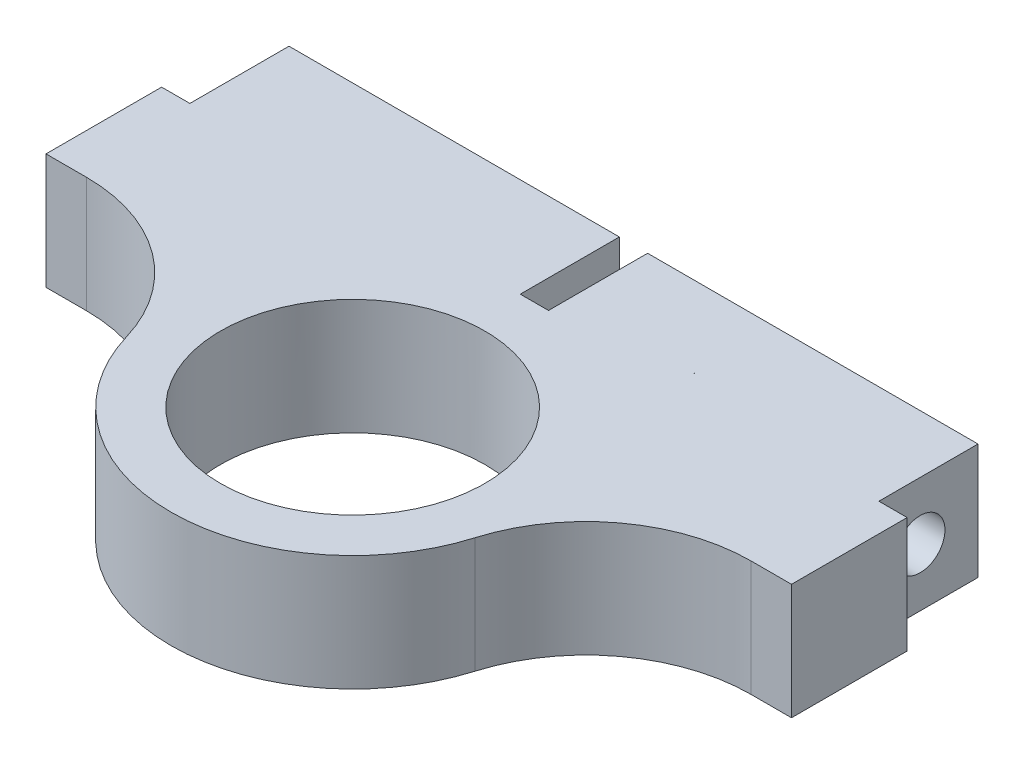
ISO-10303-21;
HEADER;
FILE_DESCRIPTION(('STEP AP214'),'2;1');
FILE_NAME('part.step','',(''),(''),'','','');
FILE_SCHEMA(('AUTOMOTIVE_DESIGN { 1 0 10303 214 1 1 1 1 }'));
ENDSEC;
DATA;
#1=APPLICATION_CONTEXT('core data for automotive mechanical design processes');
#2=APPLICATION_PROTOCOL_DEFINITION('international standard','automotive_design',2000,#1);
#3=PRODUCT_CONTEXT('',#1,'mechanical');
#4=PRODUCT('Part','Part','',(#3));
#5=PRODUCT_RELATED_PRODUCT_CATEGORY('part','',(#4));
#6=PRODUCT_DEFINITION_FORMATION('','',#4);
#7=PRODUCT_DEFINITION_CONTEXT('part definition',#1,'design');
#8=PRODUCT_DEFINITION('design','',#6,#7);
#9=PRODUCT_DEFINITION_SHAPE('','',#8);
#10=(LENGTH_UNIT() NAMED_UNIT(*) SI_UNIT(.MILLI.,.METRE.));
#11=(NAMED_UNIT(*) PLANE_ANGLE_UNIT() SI_UNIT($,.RADIAN.));
#12=(NAMED_UNIT(*) SI_UNIT($,.STERADIAN.) SOLID_ANGLE_UNIT());
#13=UNCERTAINTY_MEASURE_WITH_UNIT(LENGTH_MEASURE(1.E-05),#10,'distance_accuracy_value','');
#14=(GEOMETRIC_REPRESENTATION_CONTEXT(3) GLOBAL_UNCERTAINTY_ASSIGNED_CONTEXT((#13)) GLOBAL_UNIT_ASSIGNED_CONTEXT((#10,
#11,#12)) REPRESENTATION_CONTEXT('',''));
#15=CARTESIAN_POINT('',(0.,0.,0.));
#16=DIRECTION('',(0.,0.,1.));
#17=DIRECTION('',(1.,0.,0.));
#18=AXIS2_PLACEMENT_3D('',#15,#16,#17);
#19=CARTESIAN_POINT('',(23.42,0.,0.));
#20=DIRECTION('',(-1.,0.,0.));
#21=DIRECTION('',(0.,0.,1.));
#22=AXIS2_PLACEMENT_3D('',#19,#20,#21);
#23=PLANE('',#22);
#24=CARTESIAN_POINT('',(23.42,3.5,-5.5));
#25=DIRECTION('',(-1.,0.,0.));
#26=DIRECTION('',(0.,0.,1.));
#27=AXIS2_PLACEMENT_3D('',#24,#25,#26);
#28=CIRCLE('',#27,1.5);
#29=CARTESIAN_POINT('',(23.42,3.5,-4.));
#30=VERTEX_POINT('',#29);
#31=EDGE_CURVE('E200',#30,#30,#28,.T.);
#32=ORIENTED_EDGE('',*,*,#31,.F.);
#33=EDGE_LOOP('',(#32));
#34=FACE_BOUND('',#33,.T.);
#35=DIRECTION('',(0.,1.,0.));
#36=VECTOR('',#35,1.);
#37=CARTESIAN_POINT('',(23.42,-14.,-9.));
#38=LINE('',#37,#36);
#39=CARTESIAN_POINT('',(23.42,0.,-9.));
#40=VERTEX_POINT('',#39);
#41=CARTESIAN_POINT('',(23.42,7.,-9.));
#42=VERTEX_POINT('',#41);
#43=EDGE_CURVE('E218',#40,#42,#38,.T.);
#44=ORIENTED_EDGE('',*,*,#43,.F.);
#45=DIRECTION('',(0.,0.,-1.));
#46=VECTOR('',#45,1.);
#47=CARTESIAN_POINT('',(23.42,0.,-3.));
#48=LINE('',#47,#46);
#49=CARTESIAN_POINT('',(23.42,0.,-3.));
#50=VERTEX_POINT('',#49);
#51=EDGE_CURVE('E333',#50,#40,#48,.T.);
#52=ORIENTED_EDGE('',*,*,#51,.F.);
#53=DIRECTION('',(0.,1.,0.));
#54=VECTOR('',#53,1.);
#55=CARTESIAN_POINT('',(23.42,-14.,-3.));
#56=LINE('',#55,#54);
#57=CARTESIAN_POINT('',(23.42,7.,-3.));
#58=VERTEX_POINT('',#57);
#59=EDGE_CURVE('E219',#50,#58,#56,.T.);
#60=ORIENTED_EDGE('',*,*,#59,.T.);
#61=DIRECTION('',(0.,0.,1.));
#62=VECTOR('',#61,1.);
#63=CARTESIAN_POINT('',(23.42,7.,-12.));
#64=LINE('',#63,#62);
#65=EDGE_CURVE('E254',#42,#58,#64,.T.);
#66=ORIENTED_EDGE('',*,*,#65,.F.);
#67=EDGE_LOOP('',(#44,#52,#60,#66));
#68=FACE_BOUND('',#67,.T.);
#69=ADVANCED_FACE('F42',(#34,#68),#23,.T.);
#70=CARTESIAN_POINT('',(21.71,0.,0.));
#71=DIRECTION('',(1.,0.,0.));
#72=DIRECTION('',(0.,0.,-1.));
#73=AXIS2_PLACEMENT_3D('',#70,#71,#72);
#74=PLANE('',#73);
#75=CARTESIAN_POINT('',(21.71,3.5,-5.5));
#76=DIRECTION('',(1.,0.,0.));
#77=DIRECTION('',(0.,0.,-1.));
#78=AXIS2_PLACEMENT_3D('',#75,#76,#77);
#79=CIRCLE('',#78,1.5);
#80=CARTESIAN_POINT('',(21.71,3.5,-7.));
#81=VERTEX_POINT('',#80);
#82=EDGE_CURVE('E196',#81,#81,#79,.T.);
#83=ORIENTED_EDGE('',*,*,#82,.F.);
#84=EDGE_LOOP('',(#83));
#85=FACE_BOUND('',#84,.T.);
#86=DIRECTION('',(0.,1.,0.));
#87=VECTOR('',#86,1.);
#88=CARTESIAN_POINT('',(21.71,-14.,-3.));
#89=LINE('',#88,#87);
#90=CARTESIAN_POINT('',(21.71,0.,-3.));
#91=VERTEX_POINT('',#90);
#92=CARTESIAN_POINT('',(21.71,7.,-3.));
#93=VERTEX_POINT('',#92);
#94=EDGE_CURVE('E228',#91,#93,#89,.T.);
#95=ORIENTED_EDGE('',*,*,#94,.F.);
#96=DIRECTION('',(0.,0.,1.));
#97=VECTOR('',#96,1.);
#98=CARTESIAN_POINT('',(21.71,0.,-9.));
#99=LINE('',#98,#97);
#100=CARTESIAN_POINT('',(21.71,0.,-9.));
#101=VERTEX_POINT('',#100);
#102=EDGE_CURVE('E327',#101,#91,#99,.T.);
#103=ORIENTED_EDGE('',*,*,#102,.F.);
#104=DIRECTION('',(0.,1.,0.));
#105=VECTOR('',#104,1.);
#106=CARTESIAN_POINT('',(21.71,-14.,-9.));
#107=LINE('',#106,#105);
#108=CARTESIAN_POINT('',(21.71,7.,-9.));
#109=VERTEX_POINT('',#108);
#110=EDGE_CURVE('E209',#101,#109,#107,.T.);
#111=ORIENTED_EDGE('',*,*,#110,.T.);
#112=DIRECTION('',(0.,0.,-1.));
#113=VECTOR('',#112,1.);
#114=CARTESIAN_POINT('',(21.71,7.,-6.));
#115=LINE('',#114,#113);
#116=EDGE_CURVE('E258',#93,#109,#115,.T.);
#117=ORIENTED_EDGE('',*,*,#116,.F.);
#118=EDGE_LOOP('',(#95,#103,#111,#117));
#119=FACE_BOUND('',#118,.T.);
#120=ADVANCED_FACE('F373',(#85,#119),#74,.T.);
#121=CARTESIAN_POINT('',(1.71,0.,0.));
#122=DIRECTION('',(-1.,0.,0.));
#123=DIRECTION('',(0.,0.,1.));
#124=AXIS2_PLACEMENT_3D('',#121,#122,#123);
#125=PLANE('',#124);
#126=CARTESIAN_POINT('',(1.71,3.5,-5.5));
#127=DIRECTION('',(-1.,0.,0.));
#128=DIRECTION('',(0.,0.,1.));
#129=AXIS2_PLACEMENT_3D('',#126,#127,#128);
#130=CIRCLE('',#129,1.5);
#131=CARTESIAN_POINT('',(1.71,3.5,-4.));
#132=VERTEX_POINT('',#131);
#133=EDGE_CURVE('E183',#132,#132,#130,.T.);
#134=ORIENTED_EDGE('',*,*,#133,.F.);
#135=EDGE_LOOP('',(#134));
#136=FACE_BOUND('',#135,.T.);
#137=DIRECTION('',(0.,1.,0.));
#138=VECTOR('',#137,1.);
#139=CARTESIAN_POINT('',(1.71,0.,-9.));
#140=LINE('',#139,#138);
#141=CARTESIAN_POINT('',(1.71,0.,-9.));
#142=VERTEX_POINT('',#141);
#143=CARTESIAN_POINT('',(1.71,7.,-9.));
#144=VERTEX_POINT('',#143);
#145=EDGE_CURVE('E277',#142,#144,#140,.T.);
#146=ORIENTED_EDGE('',*,*,#145,.F.);
#147=DIRECTION('',(0.,0.,-1.));
#148=VECTOR('',#147,1.);
#149=CARTESIAN_POINT('',(1.71,0.,-3.));
#150=LINE('',#149,#148);
#151=CARTESIAN_POINT('',(1.71,0.,-3.));
#152=VERTEX_POINT('',#151);
#153=EDGE_CURVE('E321',#152,#142,#150,.T.);
#154=ORIENTED_EDGE('',*,*,#153,.F.);
#155=DIRECTION('',(0.,1.,0.));
#156=VECTOR('',#155,1.);
#157=CARTESIAN_POINT('',(1.71,-14.,-3.));
#158=LINE('',#157,#156);
#159=CARTESIAN_POINT('',(1.71,7.,-3.));
#160=VERTEX_POINT('',#159);
#161=EDGE_CURVE('E245',#152,#160,#158,.T.);
#162=ORIENTED_EDGE('',*,*,#161,.T.);
#163=DIRECTION('',(0.,0.,1.));
#164=VECTOR('',#163,1.);
#165=CARTESIAN_POINT('',(1.71,7.,-12.));
#166=LINE('',#165,#164);
#167=EDGE_CURVE('E262',#144,#160,#166,.T.);
#168=ORIENTED_EDGE('',*,*,#167,.F.);
#169=EDGE_LOOP('',(#146,#154,#162,#168));
#170=FACE_BOUND('',#169,.T.);
#171=ADVANCED_FACE('F361',(#136,#170),#125,.T.);
#172=CARTESIAN_POINT('',(0.,10.,0.));
#173=DIRECTION('',(-1.,0.,0.));
#174=DIRECTION('',(0.,0.,1.));
#175=AXIS2_PLACEMENT_3D('',#172,#173,#174);
#176=PLANE('',#175);
#177=DIRECTION('',(0.,1.,0.));
#178=VECTOR('',#177,1.);
#179=CARTESIAN_POINT('',(0.,10.,-3.));
#180=LINE('',#179,#178);
#181=CARTESIAN_POINT('',(0.,0.,-3.));
#182=VERTEX_POINT('',#181);
#183=CARTESIAN_POINT('',(0.,7.,-3.));
#184=VERTEX_POINT('',#183);
#185=EDGE_CURVE('E274',#182,#184,#180,.T.);
#186=ORIENTED_EDGE('',*,*,#185,.F.);
#187=DIRECTION('',(0.,0.,-1.));
#188=VECTOR('',#187,1.);
#189=CARTESIAN_POINT('',(0.,0.,3.99999999999998));
#190=LINE('',#189,#188);
#191=CARTESIAN_POINT('',(0.,0.,3.99999999999998));
#192=VERTEX_POINT('',#191);
#193=EDGE_CURVE('E315',#192,#182,#190,.T.);
#194=ORIENTED_EDGE('',*,*,#193,.F.);
#195=DIRECTION('',(0.,-1.,0.));
#196=VECTOR('',#195,1.);
#197=CARTESIAN_POINT('',(0.,7.,3.99999999999998));
#198=LINE('',#197,#196);
#199=CARTESIAN_POINT('',(0.,7.,3.99999999999998));
#200=VERTEX_POINT('',#199);
#201=EDGE_CURVE('E184',#200,#192,#198,.T.);
#202=ORIENTED_EDGE('',*,*,#201,.F.);
#203=DIRECTION('',(0.,0.,1.));
#204=VECTOR('',#203,1.);
#205=CARTESIAN_POINT('',(0.,7.,-6.));
#206=LINE('',#205,#204);
#207=EDGE_CURVE('E266',#184,#200,#206,.T.);
#208=ORIENTED_EDGE('',*,*,#207,.F.);
#209=EDGE_LOOP('',(#186,#194,#202,#208));
#210=FACE_BOUND('',#209,.T.);
#211=ADVANCED_FACE('F352',(#210),#176,.T.);
#212=CARTESIAN_POINT('',(22.565,10.,8.));
#213=DIRECTION('',(0.,-1.,0.));
#214=DIRECTION('',(0.,0.,-1.));
#215=AXIS2_PLACEMENT_3D('',#212,#213,#214);
#216=CYLINDRICAL_SURFACE('',#215,11.);
#217=CARTESIAN_POINT('',(22.565,0.,8.));
#218=DIRECTION('',(0.,-1.,0.));
#219=DIRECTION('',(0.,0.,-1.));
#220=AXIS2_PLACEMENT_3D('',#217,#218,#219);
#221=CIRCLE('',#220,11.);
#222=CARTESIAN_POINT('',(33.106463322499,0.,11.1428571428571));
#223=VERTEX_POINT('',#222);
#224=CARTESIAN_POINT('',(12.023536677501,0.,11.1428571428571));
#225=VERTEX_POINT('',#224);
#226=EDGE_CURVE('E59',#223,#225,#221,.T.);
#227=ORIENTED_EDGE('',*,*,#226,.F.);
#228=DIRECTION('',(0.,-1.,0.));
#229=VECTOR('',#228,1.);
#230=CARTESIAN_POINT('',(33.106463322499,10.,11.1428571428571));
#231=LINE('',#230,#229);
#232=CARTESIAN_POINT('',(33.106463322499,7.,11.1428571428571));
#233=VERTEX_POINT('',#232);
#234=EDGE_CURVE('E287',#223,#233,#231,.F.);
#235=ORIENTED_EDGE('',*,*,#234,.T.);
#236=CARTESIAN_POINT('',(22.565,7.,8.));
#237=DIRECTION('',(0.,1.,0.));
#238=DIRECTION('',(0.,0.,1.));
#239=AXIS2_PLACEMENT_3D('',#236,#237,#238);
#240=CIRCLE('',#239,11.);
#241=CARTESIAN_POINT('',(12.023536677501,7.,11.1428571428571));
#242=VERTEX_POINT('',#241);
#243=EDGE_CURVE('E270',#242,#233,#240,.T.);
#244=ORIENTED_EDGE('',*,*,#243,.F.);
#245=DIRECTION('',(0.,-1.,0.));
#246=VECTOR('',#245,1.);
#247=CARTESIAN_POINT('',(12.023536677501,10.,11.1428571428571));
#248=LINE('',#247,#246);
#249=EDGE_CURVE('E280',#242,#225,#248,.T.);
#250=ORIENTED_EDGE('',*,*,#249,.T.);
#251=EDGE_LOOP('',(#227,#235,#244,#250));
#252=FACE_BOUND('',#251,.T.);
#253=ADVANCED_FACE('F419',(#252),#216,.T.);
#254=CARTESIAN_POINT('',(45.13,10.,0.));
#255=DIRECTION('',(1.,0.,0.));
#256=DIRECTION('',(0.,0.,-1.));
#257=AXIS2_PLACEMENT_3D('',#254,#255,#256);
#258=PLANE('',#257);
#259=DIRECTION('',(0.,1.,0.));
#260=VECTOR('',#259,1.);
#261=CARTESIAN_POINT('',(45.13,-6.5,3.99999999999998));
#262=LINE('',#261,#260);
#263=CARTESIAN_POINT('',(45.13,0.,3.99999999999998));
#264=VERTEX_POINT('',#263);
#265=CARTESIAN_POINT('',(45.13,7.,3.99999999999998));
#266=VERTEX_POINT('',#265);
#267=EDGE_CURVE('E171',#264,#266,#262,.T.);
#268=ORIENTED_EDGE('',*,*,#267,.F.);
#269=DIRECTION('',(0.,0.,1.));
#270=VECTOR('',#269,1.);
#271=CARTESIAN_POINT('',(45.13,0.,-3.));
#272=LINE('',#271,#270);
#273=CARTESIAN_POINT('',(45.13,0.,-3.));
#274=VERTEX_POINT('',#273);
#275=EDGE_CURVE('E155',#274,#264,#272,.T.);
#276=ORIENTED_EDGE('',*,*,#275,.F.);
#277=DIRECTION('',(0.,1.,0.));
#278=VECTOR('',#277,1.);
#279=CARTESIAN_POINT('',(45.13,-14.,-3.));
#280=LINE('',#279,#278);
#281=CARTESIAN_POINT('',(45.13,7.,-3.));
#282=VERTEX_POINT('',#281);
#283=EDGE_CURVE('E229',#274,#282,#280,.T.);
#284=ORIENTED_EDGE('',*,*,#283,.T.);
#285=DIRECTION('',(0.,0.,-1.));
#286=VECTOR('',#285,1.);
#287=CARTESIAN_POINT('',(45.13,7.,0.));
#288=LINE('',#287,#286);
#289=EDGE_CURVE('E180',#266,#282,#288,.T.);
#290=ORIENTED_EDGE('',*,*,#289,.F.);
#291=EDGE_LOOP('',(#268,#276,#284,#290));
#292=FACE_BOUND('',#291,.T.);
#293=ADVANCED_FACE('F178',(#292),#258,.T.);
#294=CARTESIAN_POINT('',(43.42,0.,0.));
#295=DIRECTION('',(1.,0.,0.));
#296=DIRECTION('',(0.,0.,-1.));
#297=AXIS2_PLACEMENT_3D('',#294,#295,#296);
#298=PLANE('',#297);
#299=CARTESIAN_POINT('',(43.42,3.5,-5.5));
#300=DIRECTION('',(1.,0.,0.));
#301=DIRECTION('',(0.,0.,-1.));
#302=AXIS2_PLACEMENT_3D('',#299,#300,#301);
#303=CIRCLE('',#302,1.5);
#304=CARTESIAN_POINT('',(43.42,3.5,-7.));
#305=VERTEX_POINT('',#304);
#306=EDGE_CURVE('E189',#305,#305,#303,.T.);
#307=ORIENTED_EDGE('',*,*,#306,.F.);
#308=EDGE_LOOP('',(#307));
#309=FACE_BOUND('',#308,.T.);
#310=DIRECTION('',(0.,1.,0.));
#311=VECTOR('',#310,1.);
#312=CARTESIAN_POINT('',(43.42,-14.,-3.));
#313=LINE('',#312,#311);
#314=CARTESIAN_POINT('',(43.42,0.,-3.));
#315=VERTEX_POINT('',#314);
#316=CARTESIAN_POINT('',(43.42,7.,-3.));
#317=VERTEX_POINT('',#316);
#318=EDGE_CURVE('E237',#315,#317,#313,.T.);
#319=ORIENTED_EDGE('',*,*,#318,.F.);
#320=DIRECTION('',(0.,0.,1.));
#321=VECTOR('',#320,1.);
#322=CARTESIAN_POINT('',(43.42,0.,-9.));
#323=LINE('',#322,#321);
#324=CARTESIAN_POINT('',(43.42,0.,-9.));
#325=VERTEX_POINT('',#324);
#326=EDGE_CURVE('E339',#325,#315,#323,.T.);
#327=ORIENTED_EDGE('',*,*,#326,.F.);
#328=DIRECTION('',(0.,1.,0.));
#329=VECTOR('',#328,1.);
#330=CARTESIAN_POINT('',(43.42,-14.,-9.));
#331=LINE('',#330,#329);
#332=CARTESIAN_POINT('',(43.42,7.,-9.));
#333=VERTEX_POINT('',#332);
#334=EDGE_CURVE('E210',#325,#333,#331,.T.);
#335=ORIENTED_EDGE('',*,*,#334,.T.);
#336=DIRECTION('',(0.,0.,-1.));
#337=VECTOR('',#336,1.);
#338=CARTESIAN_POINT('',(43.42,7.,-6.));
#339=LINE('',#338,#337);
#340=EDGE_CURVE('E250',#317,#333,#339,.T.);
#341=ORIENTED_EDGE('',*,*,#340,.F.);
#342=EDGE_LOOP('',(#319,#327,#335,#341));
#343=FACE_BOUND('',#342,.T.);
#344=ADVANCED_FACE('F390',(#309,#343),#298,.T.);
#345=CARTESIAN_POINT('',(0.,-14.,-9.));
#346=DIRECTION('',(0.,0.,1.));
#347=DIRECTION('',(1.,0.,0.));
#348=AXIS2_PLACEMENT_3D('',#345,#346,#347);
#349=PLANE('',#348);
#350=DIRECTION('',(1.,0.,0.));
#351=VECTOR('',#350,1.);
#352=CARTESIAN_POINT('',(23.42,0.,-9.));
#353=LINE('',#352,#351);
#354=EDGE_CURVE('E336',#40,#325,#353,.T.);
#355=ORIENTED_EDGE('',*,*,#354,.F.);
#356=ORIENTED_EDGE('',*,*,#43,.T.);
#357=DIRECTION('',(1.,0.,0.));
#358=VECTOR('',#357,1.);
#359=CARTESIAN_POINT('',(0.,7.,-9.));
#360=LINE('',#359,#358);
#361=EDGE_CURVE('E214',#42,#333,#360,.T.);
#362=ORIENTED_EDGE('',*,*,#361,.T.);
#363=ORIENTED_EDGE('',*,*,#334,.F.);
#364=EDGE_LOOP('',(#355,#356,#362,#363));
#365=FACE_BOUND('',#364,.T.);
#366=ADVANCED_FACE('F384',(#365),#349,.F.);
#367=CARTESIAN_POINT('',(0.,-14.,-3.));
#368=DIRECTION('',(0.,0.,1.));
#369=DIRECTION('',(1.,0.,0.));
#370=AXIS2_PLACEMENT_3D('',#367,#368,#369);
#371=PLANE('',#370);
#372=DIRECTION('',(1.,0.,0.));
#373=VECTOR('',#372,1.);
#374=CARTESIAN_POINT('',(43.42,0.,-3.));
#375=LINE('',#374,#373);
#376=EDGE_CURVE('E161',#315,#274,#375,.T.);
#377=ORIENTED_EDGE('',*,*,#376,.F.);
#378=ORIENTED_EDGE('',*,*,#318,.T.);
#379=DIRECTION('',(1.,0.,0.));
#380=VECTOR('',#379,1.);
#381=CARTESIAN_POINT('',(0.,7.,-3.));
#382=LINE('',#381,#380);
#383=EDGE_CURVE('E204',#317,#282,#382,.T.);
#384=ORIENTED_EDGE('',*,*,#383,.T.);
#385=ORIENTED_EDGE('',*,*,#283,.F.);
#386=EDGE_LOOP('',(#377,#378,#384,#385));
#387=FACE_BOUND('',#386,.T.);
#388=ADVANCED_FACE('F393',(#387),#371,.F.);
#389=CARTESIAN_POINT('',(0.,-14.,-3.));
#390=DIRECTION('',(0.,0.,1.));
#391=DIRECTION('',(1.,0.,0.));
#392=AXIS2_PLACEMENT_3D('',#389,#390,#391);
#393=PLANE('',#392);
#394=DIRECTION('',(1.,0.,0.));
#395=VECTOR('',#394,1.);
#396=CARTESIAN_POINT('',(0.,0.,-3.));
#397=LINE('',#396,#395);
#398=EDGE_CURVE('E318',#182,#152,#397,.T.);
#399=ORIENTED_EDGE('',*,*,#398,.F.);
#400=ORIENTED_EDGE('',*,*,#185,.T.);
#401=DIRECTION('',(1.,0.,0.));
#402=VECTOR('',#401,1.);
#403=CARTESIAN_POINT('',(0.,7.,-3.));
#404=LINE('',#403,#402);
#405=EDGE_CURVE('E213',#184,#160,#404,.T.);
#406=ORIENTED_EDGE('',*,*,#405,.T.);
#407=ORIENTED_EDGE('',*,*,#161,.F.);
#408=EDGE_LOOP('',(#399,#400,#406,#407));
#409=FACE_BOUND('',#408,.T.);
#410=ADVANCED_FACE('F357',(#409),#393,.F.);
#411=CARTESIAN_POINT('',(0.,-14.,-9.));
#412=DIRECTION('',(0.,0.,1.));
#413=DIRECTION('',(1.,0.,0.));
#414=AXIS2_PLACEMENT_3D('',#411,#412,#413);
#415=PLANE('',#414);
#416=DIRECTION('',(1.,0.,0.));
#417=VECTOR('',#416,1.);
#418=CARTESIAN_POINT('',(1.71,0.,-9.));
#419=LINE('',#418,#417);
#420=EDGE_CURVE('E324',#142,#101,#419,.T.);
#421=ORIENTED_EDGE('',*,*,#420,.F.);
#422=ORIENTED_EDGE('',*,*,#145,.T.);
#423=DIRECTION('',(1.,0.,0.));
#424=VECTOR('',#423,1.);
#425=CARTESIAN_POINT('',(0.,7.,-9.));
#426=LINE('',#425,#424);
#427=EDGE_CURVE('E205',#144,#109,#426,.T.);
#428=ORIENTED_EDGE('',*,*,#427,.T.);
#429=ORIENTED_EDGE('',*,*,#110,.F.);
#430=EDGE_LOOP('',(#421,#422,#428,#429));
#431=FACE_BOUND('',#430,.T.);
#432=ADVANCED_FACE('F368',(#431),#415,.F.);
#433=CARTESIAN_POINT('',(0.,-14.,-3.));
#434=DIRECTION('',(0.,0.,1.));
#435=DIRECTION('',(1.,0.,0.));
#436=AXIS2_PLACEMENT_3D('',#433,#434,#435);
#437=PLANE('',#436);
#438=DIRECTION('',(1.,0.,0.));
#439=VECTOR('',#438,1.);
#440=CARTESIAN_POINT('',(21.71,0.,-3.));
#441=LINE('',#440,#439);
#442=EDGE_CURVE('E330',#91,#50,#441,.T.);
#443=ORIENTED_EDGE('',*,*,#442,.F.);
#444=ORIENTED_EDGE('',*,*,#94,.T.);
#445=DIRECTION('',(1.,0.,0.));
#446=VECTOR('',#445,1.);
#447=CARTESIAN_POINT('',(0.,7.,-3.));
#448=LINE('',#447,#446);
#449=EDGE_CURVE('E224',#93,#58,#448,.T.);
#450=ORIENTED_EDGE('',*,*,#449,.T.);
#451=ORIENTED_EDGE('',*,*,#59,.F.);
#452=EDGE_LOOP('',(#443,#444,#450,#451));
#453=FACE_BOUND('',#452,.T.);
#454=ADVANCED_FACE('F375',(#453),#437,.F.);
#455=CARTESIAN_POINT('',(0.,0.,3.99999999999998));
#456=DIRECTION('',(0.,0.,1.));
#457=DIRECTION('',(1.,0.,0.));
#458=AXIS2_PLACEMENT_3D('',#455,#456,#457);
#459=PLANE('',#458);
#460=DIRECTION('',(0.,-1.,0.));
#461=VECTOR('',#460,1.);
#462=CARTESIAN_POINT('',(42.6896117974981,0.,3.99999999999998));
#463=LINE('',#462,#461);
#464=CARTESIAN_POINT('',(42.6896117974981,7.,3.99999999999998));
#465=VERTEX_POINT('',#464);
#466=CARTESIAN_POINT('',(42.6896117974981,0.,3.99999999999998));
#467=VERTEX_POINT('',#466);
#468=EDGE_CURVE('E174',#465,#467,#463,.T.);
#469=ORIENTED_EDGE('',*,*,#468,.T.);
#470=DIRECTION('',(-1.,0.,0.));
#471=VECTOR('',#470,1.);
#472=CARTESIAN_POINT('',(45.13,0.,3.99999999999998));
#473=LINE('',#472,#471);
#474=EDGE_CURVE('E158',#264,#467,#473,.T.);
#475=ORIENTED_EDGE('',*,*,#474,.F.);
#476=ORIENTED_EDGE('',*,*,#267,.T.);
#477=DIRECTION('',(-1.,0.,0.));
#478=VECTOR('',#477,1.);
#479=CARTESIAN_POINT('',(45.13,7.,3.99999999999998));
#480=LINE('',#479,#478);
#481=EDGE_CURVE('E192',#266,#465,#480,.T.);
#482=ORIENTED_EDGE('',*,*,#481,.T.);
#483=EDGE_LOOP('',(#469,#475,#476,#482));
#484=FACE_BOUND('',#483,.T.);
#485=ADVANCED_FACE('F169',(#484),#459,.T.);
#486=ORIENTED_EDGE('',*,*,#201,.T.);
#487=DIRECTION('',(-1.,0.,0.));
#488=VECTOR('',#487,1.);
#489=CARTESIAN_POINT('',(2.4403882025019,0.,3.99999999999998));
#490=LINE('',#489,#488);
#491=CARTESIAN_POINT('',(2.4403882025019,0.,3.99999999999998));
#492=VERTEX_POINT('',#491);
#493=EDGE_CURVE('E312',#492,#192,#490,.T.);
#494=ORIENTED_EDGE('',*,*,#493,.F.);
#495=DIRECTION('',(0.,-1.,0.));
#496=VECTOR('',#495,1.);
#497=CARTESIAN_POINT('',(2.4403882025019,0.,3.99999999999998));
#498=LINE('',#497,#496);
#499=CARTESIAN_POINT('',(2.4403882025019,7.,3.99999999999998));
#500=VERTEX_POINT('',#499);
#501=EDGE_CURVE('E67',#492,#500,#498,.F.);
#502=ORIENTED_EDGE('',*,*,#501,.T.);
#503=EDGE_CURVE('E302',#500,#200,#480,.T.);
#504=ORIENTED_EDGE('',*,*,#503,.T.);
#505=EDGE_LOOP('',(#486,#494,#502,#504));
#506=FACE_BOUND('',#505,.T.);
#507=ADVANCED_FACE('F344',(#506),#459,.T.);
#508=CARTESIAN_POINT('',(42.6896117974981,10.,14.));
#509=DIRECTION('',(0.,-1.,0.));
#510=DIRECTION('',(0.,0.,-1.));
#511=AXIS2_PLACEMENT_3D('',#508,#509,#510);
#512=CYLINDRICAL_SURFACE('',#511,10.);
#513=CARTESIAN_POINT('',(42.6896117974981,0.,14.));
#514=DIRECTION('',(0.,1.,0.));
#515=DIRECTION('',(0.,0.,-1.));
#516=AXIS2_PLACEMENT_3D('',#513,#514,#515);
#517=CIRCLE('',#516,10.);
#518=EDGE_CURVE('E176',#467,#223,#517,.T.);
#519=ORIENTED_EDGE('',*,*,#518,.F.);
#520=ORIENTED_EDGE('',*,*,#468,.F.);
#521=CARTESIAN_POINT('',(42.6896117974981,7.,14.));
#522=DIRECTION('',(0.,1.,0.));
#523=DIRECTION('',(0.,0.,1.));
#524=AXIS2_PLACEMENT_3D('',#521,#522,#523);
#525=CIRCLE('',#524,10.);
#526=EDGE_CURVE('E52',#233,#465,#525,.F.);
#527=ORIENTED_EDGE('',*,*,#526,.F.);
#528=ORIENTED_EDGE('',*,*,#234,.F.);
#529=EDGE_LOOP('',(#519,#520,#527,#528));
#530=FACE_BOUND('',#529,.T.);
#531=ADVANCED_FACE('F303',(#530),#512,.F.);
#532=CARTESIAN_POINT('',(2.4403882025019,10.,14.));
#533=DIRECTION('',(0.,-1.,0.));
#534=DIRECTION('',(0.,0.,-1.));
#535=AXIS2_PLACEMENT_3D('',#532,#533,#534);
#536=CYLINDRICAL_SURFACE('',#535,10.);
#537=CARTESIAN_POINT('',(2.4403882025019,0.,14.));
#538=DIRECTION('',(0.,1.,0.));
#539=DIRECTION('',(0.,0.,-1.));
#540=AXIS2_PLACEMENT_3D('',#537,#538,#539);
#541=CIRCLE('',#540,10.);
#542=EDGE_CURVE('E307',#225,#492,#541,.T.);
#543=ORIENTED_EDGE('',*,*,#542,.F.);
#544=ORIENTED_EDGE('',*,*,#249,.F.);
#545=CARTESIAN_POINT('',(2.4403882025019,7.,14.));
#546=DIRECTION('',(0.,1.,0.));
#547=DIRECTION('',(0.,0.,1.));
#548=AXIS2_PLACEMENT_3D('',#545,#546,#547);
#549=CIRCLE('',#548,10.);
#550=EDGE_CURVE('E11',#500,#242,#549,.F.);
#551=ORIENTED_EDGE('',*,*,#550,.F.);
#552=ORIENTED_EDGE('',*,*,#501,.F.);
#553=EDGE_LOOP('',(#543,#544,#551,#552));
#554=FACE_BOUND('',#553,.T.);
#555=ADVANCED_FACE('F44',(#554),#536,.F.);
#556=CARTESIAN_POINT('',(22.565,7.,8.));
#557=DIRECTION('',(0.,1.,0.));
#558=DIRECTION('',(0.,0.,1.));
#559=AXIS2_PLACEMENT_3D('',#556,#557,#558);
#560=PLANE('',#559);
#561=CARTESIAN_POINT('',(22.565,7.,8.));
#562=DIRECTION('',(0.,1.,0.));
#563=DIRECTION('',(0.,0.,1.));
#564=AXIS2_PLACEMENT_3D('',#561,#562,#563);
#565=CIRCLE('',#564,8.);
#566=CARTESIAN_POINT('',(22.565,7.,16.));
#567=VERTEX_POINT('',#566);
#568=EDGE_CURVE('E505',#567,#567,#565,.T.);
#569=ORIENTED_EDGE('',*,*,#568,.F.);
#570=EDGE_LOOP('',(#569));
#571=FACE_BOUND('',#570,.T.);
#572=ORIENTED_EDGE('',*,*,#503,.F.);
#573=ORIENTED_EDGE('',*,*,#550,.T.);
#574=ORIENTED_EDGE('',*,*,#243,.T.);
#575=ORIENTED_EDGE('',*,*,#526,.T.);
#576=ORIENTED_EDGE('',*,*,#481,.F.);
#577=ORIENTED_EDGE('',*,*,#289,.T.);
#578=ORIENTED_EDGE('',*,*,#383,.F.);
#579=ORIENTED_EDGE('',*,*,#340,.T.);
#580=ORIENTED_EDGE('',*,*,#361,.F.);
#581=ORIENTED_EDGE('',*,*,#65,.T.);
#582=ORIENTED_EDGE('',*,*,#449,.F.);
#583=ORIENTED_EDGE('',*,*,#116,.T.);
#584=ORIENTED_EDGE('',*,*,#427,.F.);
#585=ORIENTED_EDGE('',*,*,#167,.T.);
#586=ORIENTED_EDGE('',*,*,#405,.F.);
#587=ORIENTED_EDGE('',*,*,#207,.T.);
#588=EDGE_LOOP('',(#572,#573,#574,#575,#576,#577,#578,#579,#580,#581,#582,#583,#584,#585,#586,#587));
#589=FACE_BOUND('',#588,.T.);
#590=ADVANCED_FACE('F297',(#571,#589),#560,.T.);
#591=CARTESIAN_POINT('',(51.71,3.5,-5.5));
#592=DIRECTION('',(-1.,0.,0.));
#593=DIRECTION('',(0.,0.,1.));
#594=AXIS2_PLACEMENT_3D('',#591,#592,#593);
#595=CYLINDRICAL_SURFACE('',#594,1.5);
#596=ORIENTED_EDGE('',*,*,#31,.T.);
#597=EDGE_LOOP('',(#596));
#598=FACE_BOUND('',#597,.T.);
#599=ORIENTED_EDGE('',*,*,#306,.T.);
#600=EDGE_LOOP('',(#599));
#601=FACE_BOUND('',#600,.T.);
#602=ADVANCED_FACE('F440',(#598,#601),#595,.F.);
#603=ORIENTED_EDGE('',*,*,#82,.T.);
#604=EDGE_LOOP('',(#603));
#605=FACE_BOUND('',#604,.T.);
#606=ORIENTED_EDGE('',*,*,#133,.T.);
#607=EDGE_LOOP('',(#606));
#608=FACE_BOUND('',#607,.T.);
#609=ADVANCED_FACE('F437',(#605,#608),#595,.F.);
#610=CARTESIAN_POINT('',(42.6896117974981,0.,14.));
#611=DIRECTION('',(0.,-1.,0.));
#612=DIRECTION('',(0.,0.,-1.));
#613=AXIS2_PLACEMENT_3D('',#610,#611,#612);
#614=PLANE('',#613);
#615=CARTESIAN_POINT('',(22.565,0.,8.));
#616=DIRECTION('',(0.,-1.,0.));
#617=DIRECTION('',(0.,0.,-1.));
#618=AXIS2_PLACEMENT_3D('',#615,#616,#617);
#619=CIRCLE('',#618,8.);
#620=CARTESIAN_POINT('',(22.565,0.,0.));
#621=VERTEX_POINT('',#620);
#622=EDGE_CURVE('E46',#621,#621,#619,.T.);
#623=ORIENTED_EDGE('',*,*,#622,.F.);
#624=EDGE_LOOP('',(#623));
#625=FACE_BOUND('',#624,.T.);
#626=ORIENTED_EDGE('',*,*,#275,.T.);
#627=ORIENTED_EDGE('',*,*,#474,.T.);
#628=ORIENTED_EDGE('',*,*,#518,.T.);
#629=ORIENTED_EDGE('',*,*,#226,.T.);
#630=ORIENTED_EDGE('',*,*,#542,.T.);
#631=ORIENTED_EDGE('',*,*,#493,.T.);
#632=ORIENTED_EDGE('',*,*,#193,.T.);
#633=ORIENTED_EDGE('',*,*,#398,.T.);
#634=ORIENTED_EDGE('',*,*,#153,.T.);
#635=ORIENTED_EDGE('',*,*,#420,.T.);
#636=ORIENTED_EDGE('',*,*,#102,.T.);
#637=ORIENTED_EDGE('',*,*,#442,.T.);
#638=ORIENTED_EDGE('',*,*,#51,.T.);
#639=ORIENTED_EDGE('',*,*,#354,.T.);
#640=ORIENTED_EDGE('',*,*,#326,.T.);
#641=ORIENTED_EDGE('',*,*,#376,.T.);
#642=EDGE_LOOP('',(#626,#627,#628,#629,#630,#631,#632,#633,#634,#635,#636,#637,#638,#639,#640,#641));
#643=FACE_BOUND('',#642,.T.);
#644=ADVANCED_FACE('F157',(#625,#643),#614,.T.);
#645=CARTESIAN_POINT('',(22.565,-12.5,8.));
#646=DIRECTION('',(0.,1.,0.));
#647=DIRECTION('',(0.,0.,1.));
#648=AXIS2_PLACEMENT_3D('',#645,#646,#647);
#649=CYLINDRICAL_SURFACE('',#648,8.);
#650=ORIENTED_EDGE('',*,*,#622,.T.);
#651=EDGE_LOOP('',(#650));
#652=FACE_BOUND('',#651,.T.);
#653=ORIENTED_EDGE('',*,*,#568,.T.);
#654=EDGE_LOOP('',(#653));
#655=FACE_BOUND('',#654,.T.);
#656=ADVANCED_FACE('F487',(#652,#655),#649,.F.);
#657=CLOSED_SHELL('',(#69,#120,#171,#211,#253,#293,#344,#366,#388,#410,#432,#454,#485,#507,#531,
#555,#590,#602,#609,#644,#656));
#658=MANIFOLD_SOLID_BREP('B2',#657);
#659=ADVANCED_BREP_SHAPE_REPRESENTATION('',(#18,#658),#14);
#660=SHAPE_DEFINITION_REPRESENTATION(#9,#659);
ENDSEC;
END-ISO-10303-21;
